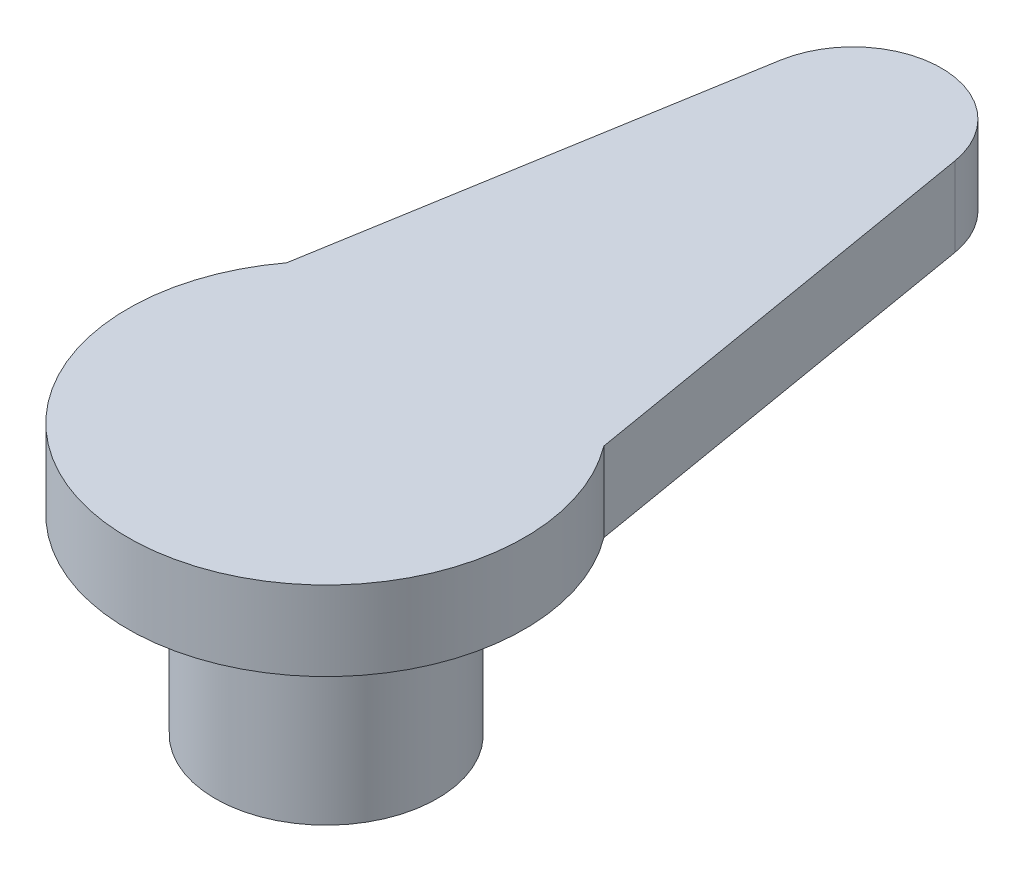
ISO-10303-21;
HEADER;
FILE_DESCRIPTION(('STEP AP214'),'2;1');
FILE_NAME('part.step','',(''),(''),'','','');
FILE_SCHEMA(('AUTOMOTIVE_DESIGN { 1 0 10303 214 1 1 1 1 }'));
ENDSEC;
DATA;
#1=APPLICATION_CONTEXT('core data for automotive mechanical design processes');
#2=APPLICATION_PROTOCOL_DEFINITION('international standard','automotive_design',2000,#1);
#3=PRODUCT_CONTEXT('',#1,'mechanical');
#4=PRODUCT('Part','Part','',(#3));
#5=PRODUCT_RELATED_PRODUCT_CATEGORY('part','',(#4));
#6=PRODUCT_DEFINITION_FORMATION('','',#4);
#7=PRODUCT_DEFINITION_CONTEXT('part definition',#1,'design');
#8=PRODUCT_DEFINITION('design','',#6,#7);
#9=PRODUCT_DEFINITION_SHAPE('','',#8);
#10=(LENGTH_UNIT() NAMED_UNIT(*) SI_UNIT(.MILLI.,.METRE.));
#11=(NAMED_UNIT(*) PLANE_ANGLE_UNIT() SI_UNIT($,.RADIAN.));
#12=(NAMED_UNIT(*) SI_UNIT($,.STERADIAN.) SOLID_ANGLE_UNIT());
#13=UNCERTAINTY_MEASURE_WITH_UNIT(LENGTH_MEASURE(1.E-05),#10,'distance_accuracy_value','');
#14=(GEOMETRIC_REPRESENTATION_CONTEXT(3) GLOBAL_UNCERTAINTY_ASSIGNED_CONTEXT((#13)) GLOBAL_UNIT_ASSIGNED_CONTEXT((#10,
#11,#12)) REPRESENTATION_CONTEXT('',''));
#15=CARTESIAN_POINT('',(0.,0.,0.));
#16=DIRECTION('',(0.,0.,1.));
#17=DIRECTION('',(1.,0.,0.));
#18=AXIS2_PLACEMENT_3D('',#15,#16,#17);
#19=CARTESIAN_POINT('',(0.,2.5,-16.5963446718734));
#20=DIRECTION('',(0.,-1.,0.));
#21=DIRECTION('',(0.,0.,-1.));
#22=AXIS2_PLACEMENT_3D('',#19,#20,#21);
#23=CYLINDRICAL_SURFACE('',#22,2.78900904060411);
#24=CARTESIAN_POINT('',(0.,0.,-16.5963446718734));
#25=DIRECTION('',(0.,1.,0.));
#26=DIRECTION('',(0.,0.,1.));
#27=AXIS2_PLACEMENT_3D('',#24,#25,#26);
#28=CIRCLE('',#27,2.78900904060411);
#29=CARTESIAN_POINT('',(-2.75,0.,-17.0611795119741));
#30=VERTEX_POINT('',#29);
#31=CARTESIAN_POINT('',(2.75,0.,-17.0611795119741));
#32=VERTEX_POINT('',#31);
#33=EDGE_CURVE('E118',#30,#32,#28,.F.);
#34=ORIENTED_EDGE('',*,*,#33,.F.);
#35=DIRECTION('',(0.,-1.,0.));
#36=VECTOR('',#35,1.);
#37=CARTESIAN_POINT('',(-2.75,2.5,-17.0611795119741));
#38=LINE('',#37,#36);
#39=CARTESIAN_POINT('',(-2.75,2.5,-17.0611795119741));
#40=VERTEX_POINT('',#39);
#41=EDGE_CURVE('E44',#40,#30,#38,.T.);
#42=ORIENTED_EDGE('',*,*,#41,.F.);
#43=CARTESIAN_POINT('',(0.,2.5,-16.5963446718734));
#44=DIRECTION('',(0.,1.,0.));
#45=DIRECTION('',(0.,0.,1.));
#46=AXIS2_PLACEMENT_3D('',#43,#44,#45);
#47=CIRCLE('',#46,2.78900904060411);
#48=CARTESIAN_POINT('',(2.75,2.5,-17.0611795119741));
#49=VERTEX_POINT('',#48);
#50=EDGE_CURVE('E119',#40,#49,#47,.F.);
#51=ORIENTED_EDGE('',*,*,#50,.T.);
#52=DIRECTION('',(0.,-1.,0.));
#53=VECTOR('',#52,1.);
#54=CARTESIAN_POINT('',(2.75,2.5,-17.0611795119741));
#55=LINE('',#54,#53);
#56=EDGE_CURVE('E81',#49,#32,#55,.T.);
#57=ORIENTED_EDGE('',*,*,#56,.T.);
#58=EDGE_LOOP('',(#34,#42,#51,#57));
#59=FACE_BOUND('',#58,.T.);
#60=ADVANCED_FACE('F37',(#59),#23,.T.);
#61=CARTESIAN_POINT('',(-5.47736942185066,2.5,-0.925844414319391));
#62=DIRECTION('',(-0.986013297183269,0.,-0.166666666666667));
#63=DIRECTION('',(-0.166666666666667,0.,0.986013297183269));
#64=AXIS2_PLACEMENT_3D('',#61,#62,#63);
#65=PLANE('',#64);
#66=DIRECTION('',(0.166666666666667,0.,-0.986013297183269));
#67=VECTOR('',#66,1.);
#68=CARTESIAN_POINT('',(-5.47736942185066,0.,-0.925844414319391));
#69=LINE('',#68,#67);
#70=CARTESIAN_POINT('',(-5.,0.,-3.75));
#71=VERTEX_POINT('',#70);
#72=EDGE_CURVE('E130',#71,#30,#69,.T.);
#73=ORIENTED_EDGE('',*,*,#72,.F.);
#74=DIRECTION('',(0.,-1.,0.));
#75=VECTOR('',#74,1.);
#76=CARTESIAN_POINT('',(-5.,2.5,-3.75));
#77=LINE('',#76,#75);
#78=CARTESIAN_POINT('',(-5.,2.5,-3.75));
#79=VERTEX_POINT('',#78);
#80=EDGE_CURVE('E140',#79,#71,#77,.T.);
#81=ORIENTED_EDGE('',*,*,#80,.F.);
#82=DIRECTION('',(0.166666666666667,0.,-0.986013297183269));
#83=VECTOR('',#82,1.);
#84=CARTESIAN_POINT('',(-5.47736942185066,2.5,-0.925844414319391));
#85=LINE('',#84,#83);
#86=EDGE_CURVE('E121',#79,#40,#85,.T.);
#87=ORIENTED_EDGE('',*,*,#86,.T.);
#88=ORIENTED_EDGE('',*,*,#41,.T.);
#89=EDGE_LOOP('',(#73,#81,#87,#88));
#90=FACE_BOUND('',#89,.T.);
#91=ADVANCED_FACE('F143',(#90),#65,.T.);
#92=CARTESIAN_POINT('',(0.,2.5,0.));
#93=DIRECTION('',(0.,-1.,0.));
#94=DIRECTION('',(0.,0.,-1.));
#95=AXIS2_PLACEMENT_3D('',#92,#93,#94);
#96=CYLINDRICAL_SURFACE('',#95,6.25);
#97=CARTESIAN_POINT('',(0.,0.,0.));
#98=DIRECTION('',(0.,1.,0.));
#99=DIRECTION('',(0.,0.,1.));
#100=AXIS2_PLACEMENT_3D('',#97,#98,#99);
#101=CIRCLE('',#100,6.25);
#102=CARTESIAN_POINT('',(5.,0.,-3.75));
#103=VERTEX_POINT('',#102);
#104=EDGE_CURVE('E133',#71,#103,#101,.T.);
#105=ORIENTED_EDGE('',*,*,#104,.T.);
#106=DIRECTION('',(0.,-1.,0.));
#107=VECTOR('',#106,1.);
#108=CARTESIAN_POINT('',(5.,2.5,-3.75));
#109=LINE('',#108,#107);
#110=CARTESIAN_POINT('',(5.,2.5,-3.75));
#111=VERTEX_POINT('',#110);
#112=EDGE_CURVE('E137',#111,#103,#109,.T.);
#113=ORIENTED_EDGE('',*,*,#112,.F.);
#114=CARTESIAN_POINT('',(0.,2.5,0.));
#115=DIRECTION('',(0.,1.,0.));
#116=DIRECTION('',(0.,0.,1.));
#117=AXIS2_PLACEMENT_3D('',#114,#115,#116);
#118=CIRCLE('',#117,6.25);
#119=EDGE_CURVE('E125',#79,#111,#118,.T.);
#120=ORIENTED_EDGE('',*,*,#119,.F.);
#121=ORIENTED_EDGE('',*,*,#80,.T.);
#122=EDGE_LOOP('',(#105,#113,#120,#121));
#123=FACE_BOUND('',#122,.T.);
#124=ADVANCED_FACE('F151',(#123),#96,.T.);
#125=CARTESIAN_POINT('',(5.47736942185066,2.5,-0.925844414319391));
#126=DIRECTION('',(-0.986013297183269,0.,0.166666666666667));
#127=DIRECTION('',(0.166666666666667,0.,0.986013297183269));
#128=AXIS2_PLACEMENT_3D('',#125,#126,#127);
#129=PLANE('',#128);
#130=DIRECTION('',(-0.166666666666667,0.,-0.986013297183269));
#131=VECTOR('',#130,1.);
#132=CARTESIAN_POINT('',(5.47736942185066,0.,-0.925844414319391));
#133=LINE('',#132,#131);
#134=EDGE_CURVE('E122',#103,#32,#133,.T.);
#135=ORIENTED_EDGE('',*,*,#134,.T.);
#136=ORIENTED_EDGE('',*,*,#56,.F.);
#137=DIRECTION('',(-0.166666666666667,0.,-0.986013297183269));
#138=VECTOR('',#137,1.);
#139=CARTESIAN_POINT('',(5.47736942185066,2.5,-0.925844414319391));
#140=LINE('',#139,#138);
#141=EDGE_CURVE('E60',#111,#49,#140,.T.);
#142=ORIENTED_EDGE('',*,*,#141,.F.);
#143=ORIENTED_EDGE('',*,*,#112,.T.);
#144=EDGE_LOOP('',(#135,#136,#142,#143));
#145=FACE_BOUND('',#144,.T.);
#146=ADVANCED_FACE('F154',(#145),#129,.F.);
#147=CARTESIAN_POINT('',(0.,2.5,0.));
#148=DIRECTION('',(0.,1.,0.));
#149=DIRECTION('',(0.,0.,1.));
#150=AXIS2_PLACEMENT_3D('',#147,#148,#149);
#151=PLANE('',#150);
#152=ORIENTED_EDGE('',*,*,#50,.F.);
#153=ORIENTED_EDGE('',*,*,#86,.F.);
#154=ORIENTED_EDGE('',*,*,#119,.T.);
#155=ORIENTED_EDGE('',*,*,#141,.T.);
#156=EDGE_LOOP('',(#152,#153,#154,#155));
#157=FACE_BOUND('',#156,.T.);
#158=ADVANCED_FACE('F155',(#157),#151,.T.);
#159=CARTESIAN_POINT('',(0.,0.,0.));
#160=DIRECTION('',(0.,1.,0.));
#161=DIRECTION('',(0.,0.,1.));
#162=AXIS2_PLACEMENT_3D('',#159,#160,#161);
#163=PLANE('',#162);
#164=CARTESIAN_POINT('',(0.,0.,0.));
#165=DIRECTION('',(0.,1.,0.));
#166=DIRECTION('',(0.,0.,1.));
#167=AXIS2_PLACEMENT_3D('',#164,#165,#166);
#168=CIRCLE('',#167,3.5);
#169=CARTESIAN_POINT('',(0.,0.,3.5));
#170=VERTEX_POINT('',#169);
#171=EDGE_CURVE('E11',#170,#170,#168,.F.);
#172=ORIENTED_EDGE('',*,*,#171,.F.);
#173=EDGE_LOOP('',(#172));
#174=FACE_BOUND('',#173,.T.);
#175=ORIENTED_EDGE('',*,*,#33,.T.);
#176=ORIENTED_EDGE('',*,*,#134,.F.);
#177=ORIENTED_EDGE('',*,*,#104,.F.);
#178=ORIENTED_EDGE('',*,*,#72,.T.);
#179=EDGE_LOOP('',(#175,#176,#177,#178));
#180=FACE_BOUND('',#179,.T.);
#181=ADVANCED_FACE('F148',(#174,#180),#163,.F.);
#182=CARTESIAN_POINT('',(0.,-6.,0.));
#183=DIRECTION('',(0.,1.,0.));
#184=DIRECTION('',(0.,0.,1.));
#185=AXIS2_PLACEMENT_3D('',#182,#183,#184);
#186=CYLINDRICAL_SURFACE('',#185,3.5);
#187=CARTESIAN_POINT('',(0.,-6.,0.));
#188=DIRECTION('',(0.,-1.,0.));
#189=DIRECTION('',(0.,0.,-1.));
#190=AXIS2_PLACEMENT_3D('',#187,#188,#189);
#191=CIRCLE('',#190,3.5);
#192=CARTESIAN_POINT('',(0.,-6.,-3.5));
#193=VERTEX_POINT('',#192);
#194=EDGE_CURVE('E115',#193,#193,#191,.T.);
#195=ORIENTED_EDGE('',*,*,#194,.F.);
#196=EDGE_LOOP('',(#195));
#197=FACE_BOUND('',#196,.T.);
#198=ORIENTED_EDGE('',*,*,#171,.T.);
#199=EDGE_LOOP('',(#198));
#200=FACE_BOUND('',#199,.T.);
#201=ADVANCED_FACE('F163',(#197,#200),#186,.T.);
#202=CARTESIAN_POINT('',(0.,-6.,0.));
#203=DIRECTION('',(0.,-1.,0.));
#204=DIRECTION('',(0.,0.,-1.));
#205=AXIS2_PLACEMENT_3D('',#202,#203,#204);
#206=PLANE('',#205);
#207=CARTESIAN_POINT('',(0.,-6.,0.));
#208=DIRECTION('',(0.,-1.,0.));
#209=DIRECTION('',(0.,0.,-1.));
#210=AXIS2_PLACEMENT_3D('',#207,#208,#209);
#211=CIRCLE('',#210,2.075);
#212=CARTESIAN_POINT('',(1.45945195193264,-6.,-1.475));
#213=VERTEX_POINT('',#212);
#214=CARTESIAN_POINT('',(-1.45945195193264,-6.,-1.475));
#215=VERTEX_POINT('',#214);
#216=EDGE_CURVE('E51',#213,#215,#211,.T.);
#217=ORIENTED_EDGE('',*,*,#216,.F.);
#218=DIRECTION('',(-1.,0.,0.));
#219=VECTOR('',#218,1.);
#220=CARTESIAN_POINT('',(0.,-6.,-1.475));
#221=LINE('',#220,#219);
#222=EDGE_CURVE('E112',#213,#215,#221,.T.);
#223=ORIENTED_EDGE('',*,*,#222,.T.);
#224=EDGE_LOOP('',(#217,#223));
#225=FACE_BOUND('',#224,.T.);
#226=ORIENTED_EDGE('',*,*,#194,.T.);
#227=EDGE_LOOP('',(#226));
#228=FACE_BOUND('',#227,.T.);
#229=ADVANCED_FACE('F200',(#225,#228),#206,.T.);
#230=CARTESIAN_POINT('',(0.,0.,0.));
#231=DIRECTION('',(0.,1.,0.));
#232=DIRECTION('',(0.,0.,1.));
#233=AXIS2_PLACEMENT_3D('',#230,#231,#232);
#234=PLANE('',#233);
#235=CARTESIAN_POINT('',(0.,0.,0.));
#236=DIRECTION('',(0.,1.,0.));
#237=DIRECTION('',(0.,0.,1.));
#238=AXIS2_PLACEMENT_3D('',#235,#236,#237);
#239=CIRCLE('',#238,2.075);
#240=CARTESIAN_POINT('',(1.45945195193264,0.,-1.475));
#241=VERTEX_POINT('',#240);
#242=CARTESIAN_POINT('',(-1.45945195193264,0.,-1.475));
#243=VERTEX_POINT('',#242);
#244=EDGE_CURVE('E106',#241,#243,#239,.F.);
#245=ORIENTED_EDGE('',*,*,#244,.T.);
#246=DIRECTION('',(-1.,0.,0.));
#247=VECTOR('',#246,1.);
#248=CARTESIAN_POINT('',(0.,0.,-1.475));
#249=LINE('',#248,#247);
#250=EDGE_CURVE('E96',#241,#243,#249,.T.);
#251=ORIENTED_EDGE('',*,*,#250,.F.);
#252=EDGE_LOOP('',(#245,#251));
#253=FACE_BOUND('',#252,.T.);
#254=ADVANCED_FACE('F108',(#253),#234,.F.);
#255=CARTESIAN_POINT('',(0.,5.46122696836526,0.));
#256=DIRECTION('',(0.,-1.,0.));
#257=DIRECTION('',(0.,0.,-1.));
#258=AXIS2_PLACEMENT_3D('',#255,#256,#257);
#259=CYLINDRICAL_SURFACE('',#258,2.075);
#260=DIRECTION('',(0.,-1.,0.));
#261=VECTOR('',#260,1.);
#262=CARTESIAN_POINT('',(1.45945195193264,5.46122696836526,-1.475));
#263=LINE('',#262,#261);
#264=EDGE_CURVE('E101',#241,#213,#263,.T.);
#265=ORIENTED_EDGE('',*,*,#264,.T.);
#266=ORIENTED_EDGE('',*,*,#216,.T.);
#267=DIRECTION('',(0.,-1.,0.));
#268=VECTOR('',#267,1.);
#269=CARTESIAN_POINT('',(-1.45945195193264,5.46122696836526,-1.475));
#270=LINE('',#269,#268);
#271=EDGE_CURVE('E99',#243,#215,#270,.T.);
#272=ORIENTED_EDGE('',*,*,#271,.F.);
#273=ORIENTED_EDGE('',*,*,#244,.F.);
#274=EDGE_LOOP('',(#265,#266,#272,#273));
#275=FACE_BOUND('',#274,.T.);
#276=ADVANCED_FACE('F105',(#275),#259,.F.);
#277=CARTESIAN_POINT('',(0.,5.46122696836526,-1.475));
#278=DIRECTION('',(0.,0.,1.));
#279=DIRECTION('',(1.,0.,0.));
#280=AXIS2_PLACEMENT_3D('',#277,#278,#279);
#281=PLANE('',#280);
#282=ORIENTED_EDGE('',*,*,#250,.T.);
#283=ORIENTED_EDGE('',*,*,#271,.T.);
#284=ORIENTED_EDGE('',*,*,#222,.F.);
#285=ORIENTED_EDGE('',*,*,#264,.F.);
#286=EDGE_LOOP('',(#282,#283,#284,#285));
#287=FACE_BOUND('',#286,.T.);
#288=ADVANCED_FACE('F97',(#287),#281,.T.);
#289=CLOSED_SHELL('',(#60,#91,#124,#146,#158,#181,#201,#229,#254,#276,#288));
#290=MANIFOLD_SOLID_BREP('B2',#289);
#291=ADVANCED_BREP_SHAPE_REPRESENTATION('',(#18,#290),#14);
#292=SHAPE_DEFINITION_REPRESENTATION(#9,#291);
ENDSEC;
END-ISO-10303-21;
